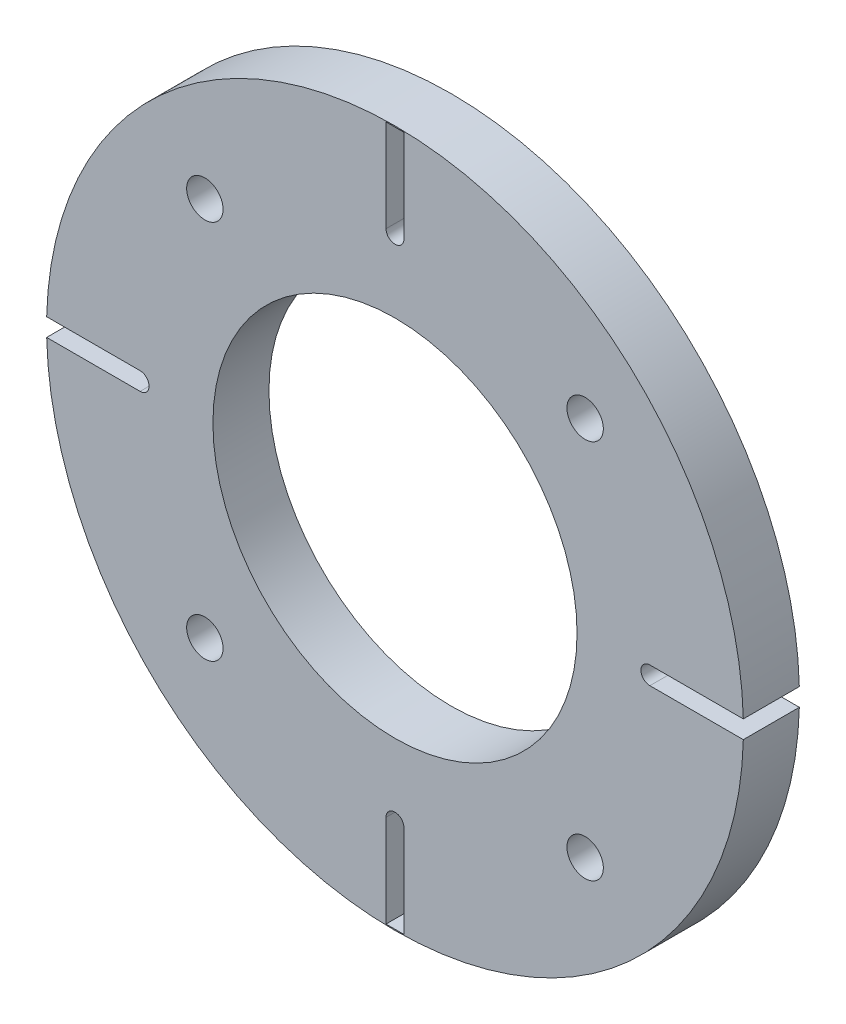
ISO-10303-21;
HEADER;
FILE_DESCRIPTION(('STEP AP214'),'2;1');
FILE_NAME('part.step','',(''),(''),'','','');
FILE_SCHEMA(('AUTOMOTIVE_DESIGN { 1 0 10303 214 1 1 1 1 }'));
ENDSEC;
DATA;
#1=APPLICATION_CONTEXT('core data for automotive mechanical design processes');
#2=APPLICATION_PROTOCOL_DEFINITION('international standard','automotive_design',2000,#1);
#3=PRODUCT_CONTEXT('',#1,'mechanical');
#4=PRODUCT('Part','Part','',(#3));
#5=PRODUCT_RELATED_PRODUCT_CATEGORY('part','',(#4));
#6=PRODUCT_DEFINITION_FORMATION('','',#4);
#7=PRODUCT_DEFINITION_CONTEXT('part definition',#1,'design');
#8=PRODUCT_DEFINITION('design','',#6,#7);
#9=PRODUCT_DEFINITION_SHAPE('','',#8);
#10=(LENGTH_UNIT() NAMED_UNIT(*) SI_UNIT(.MILLI.,.METRE.));
#11=(NAMED_UNIT(*) PLANE_ANGLE_UNIT() SI_UNIT($,.RADIAN.));
#12=(NAMED_UNIT(*) SI_UNIT($,.STERADIAN.) SOLID_ANGLE_UNIT());
#13=UNCERTAINTY_MEASURE_WITH_UNIT(LENGTH_MEASURE(1.E-05),#10,'distance_accuracy_value','');
#14=(GEOMETRIC_REPRESENTATION_CONTEXT(3) GLOBAL_UNCERTAINTY_ASSIGNED_CONTEXT((#13)) GLOBAL_UNIT_ASSIGNED_CONTEXT((#10,
#11,#12)) REPRESENTATION_CONTEXT('',''));
#15=CARTESIAN_POINT('',(0.,0.,0.));
#16=DIRECTION('',(0.,0.,1.));
#17=DIRECTION('',(1.,0.,0.));
#18=AXIS2_PLACEMENT_3D('',#15,#16,#17);
#19=CARTESIAN_POINT('',(0.,0.,10.));
#20=DIRECTION('',(0.,0.,1.));
#21=DIRECTION('',(1.,0.,0.));
#22=AXIS2_PLACEMENT_3D('',#19,#20,#21);
#23=PLANE('',#22);
#24=CARTESIAN_POINT('',(-33.9411254969543,33.9411254969543,10.));
#25=DIRECTION('',(0.,0.,-1.));
#26=DIRECTION('',(-1.,0.,0.));
#27=AXIS2_PLACEMENT_3D('',#24,#25,#26);
#28=CIRCLE('',#27,3.25);
#29=CARTESIAN_POINT('',(-37.1911254969543,33.9411254969543,10.));
#30=VERTEX_POINT('',#29);
#31=EDGE_CURVE('E387',#30,#30,#28,.F.);
#32=ORIENTED_EDGE('',*,*,#31,.F.);
#33=EDGE_LOOP('',(#32));
#34=FACE_BOUND('',#33,.T.);
#35=CARTESIAN_POINT('',(33.9411254969543,33.9411254969543,10.));
#36=DIRECTION('',(0.,0.,-1.));
#37=DIRECTION('',(-1.,0.,0.));
#38=AXIS2_PLACEMENT_3D('',#35,#36,#37);
#39=CIRCLE('',#38,3.25);
#40=CARTESIAN_POINT('',(30.6911254969543,33.9411254969543,10.));
#41=VERTEX_POINT('',#40);
#42=EDGE_CURVE('E295',#41,#41,#39,.T.);
#43=ORIENTED_EDGE('',*,*,#42,.T.);
#44=EDGE_LOOP('',(#43));
#45=FACE_BOUND('',#44,.T.);
#46=DIRECTION('',(-1.,0.,0.));
#47=VECTOR('',#46,1.);
#48=CARTESIAN_POINT('',(62.2,1.6,10.));
#49=LINE('',#48,#47);
#50=CARTESIAN_POINT('',(62.179417816509,1.6,10.));
#51=VERTEX_POINT('',#50);
#52=CARTESIAN_POINT('',(45.5,1.6,10.));
#53=VERTEX_POINT('',#52);
#54=EDGE_CURVE('E186',#51,#53,#49,.T.);
#55=ORIENTED_EDGE('',*,*,#54,.F.);
#56=CARTESIAN_POINT('',(0.,0.,10.));
#57=DIRECTION('',(0.,0.,1.));
#58=DIRECTION('',(1.,0.,0.));
#59=AXIS2_PLACEMENT_3D('',#56,#57,#58);
#60=CIRCLE('',#59,62.2);
#61=CARTESIAN_POINT('',(-62.179417816509,1.59999999999997,10.));
#62=VERTEX_POINT('',#61);
#63=EDGE_CURVE('E338',#51,#62,#60,.T.);
#64=ORIENTED_EDGE('',*,*,#63,.T.);
#65=DIRECTION('',(-1.,0.,0.));
#66=VECTOR('',#65,1.);
#67=CARTESIAN_POINT('',(-62.2,1.59999999999997,10.));
#68=LINE('',#67,#66);
#69=CARTESIAN_POINT('',(-45.5,1.6,10.));
#70=VERTEX_POINT('',#69);
#71=EDGE_CURVE('E299',#70,#62,#68,.T.);
#72=ORIENTED_EDGE('',*,*,#71,.F.);
#73=CARTESIAN_POINT('',(-45.5,0.,10.));
#74=DIRECTION('',(0.,0.,1.));
#75=DIRECTION('',(-1.,0.,0.));
#76=AXIS2_PLACEMENT_3D('',#73,#74,#75);
#77=CIRCLE('',#76,1.6);
#78=CARTESIAN_POINT('',(-45.5,-1.6,10.));
#79=VERTEX_POINT('',#78);
#80=EDGE_CURVE('E257',#79,#70,#77,.T.);
#81=ORIENTED_EDGE('',*,*,#80,.F.);
#82=DIRECTION('',(1.,0.,0.));
#83=VECTOR('',#82,1.);
#84=CARTESIAN_POINT('',(-62.2,-1.60000000000005,10.));
#85=LINE('',#84,#83);
#86=CARTESIAN_POINT('',(-62.179417816509,-1.60000000000005,10.));
#87=VERTEX_POINT('',#86);
#88=EDGE_CURVE('E296',#87,#79,#85,.T.);
#89=ORIENTED_EDGE('',*,*,#88,.F.);
#90=CARTESIAN_POINT('',(62.179417816509,-1.6,10.));
#91=VERTEX_POINT('',#90);
#92=EDGE_CURVE('E334',#87,#91,#60,.T.);
#93=ORIENTED_EDGE('',*,*,#92,.T.);
#94=DIRECTION('',(1.,0.,0.));
#95=VECTOR('',#94,1.);
#96=CARTESIAN_POINT('',(62.2,-1.6,10.));
#97=LINE('',#96,#95);
#98=CARTESIAN_POINT('',(45.5,-1.6,10.));
#99=VERTEX_POINT('',#98);
#100=EDGE_CURVE('E189',#99,#91,#97,.T.);
#101=ORIENTED_EDGE('',*,*,#100,.F.);
#102=CARTESIAN_POINT('',(45.5,0.,10.));
#103=DIRECTION('',(0.,0.,1.));
#104=DIRECTION('',(1.,0.,0.));
#105=AXIS2_PLACEMENT_3D('',#102,#103,#104);
#106=CIRCLE('',#105,1.6);
#107=EDGE_CURVE('E166',#53,#99,#106,.T.);
#108=ORIENTED_EDGE('',*,*,#107,.F.);
#109=EDGE_LOOP('',(#55,#64,#72,#81,#89,#93,#101,#108));
#110=FACE_BOUND('',#109,.T.);
#111=CARTESIAN_POINT('',(0.,45.5,10.));
#112=DIRECTION('',(0.,0.,1.));
#113=DIRECTION('',(1.,0.,0.));
#114=AXIS2_PLACEMENT_3D('',#111,#112,#113);
#115=CIRCLE('',#114,1.6);
#116=CARTESIAN_POINT('',(-1.6,45.5,10.));
#117=VERTEX_POINT('',#116);
#118=CARTESIAN_POINT('',(1.6,45.5,10.));
#119=VERTEX_POINT('',#118);
#120=EDGE_CURVE('E61',#117,#119,#115,.T.);
#121=ORIENTED_EDGE('',*,*,#120,.F.);
#122=DIRECTION('',(0.,-1.,0.));
#123=VECTOR('',#122,1.);
#124=CARTESIAN_POINT('',(-1.6,62.,10.));
#125=LINE('',#124,#123);
#126=CARTESIAN_POINT('',(-1.6,62.,10.));
#127=VERTEX_POINT('',#126);
#128=EDGE_CURVE('E215',#127,#117,#125,.T.);
#129=ORIENTED_EDGE('',*,*,#128,.F.);
#130=DIRECTION('',(-1.,0.,0.));
#131=VECTOR('',#130,1.);
#132=CARTESIAN_POINT('',(-1.6,62.,10.));
#133=LINE('',#132,#131);
#134=CARTESIAN_POINT('',(1.6,62.,10.));
#135=VERTEX_POINT('',#134);
#136=EDGE_CURVE('E219',#135,#127,#133,.T.);
#137=ORIENTED_EDGE('',*,*,#136,.F.);
#138=DIRECTION('',(0.,1.,0.));
#139=VECTOR('',#138,1.);
#140=CARTESIAN_POINT('',(1.6,62.,10.));
#141=LINE('',#140,#139);
#142=EDGE_CURVE('E224',#119,#135,#141,.T.);
#143=ORIENTED_EDGE('',*,*,#142,.F.);
#144=EDGE_LOOP('',(#121,#129,#137,#143));
#145=FACE_BOUND('',#144,.T.);
#146=CARTESIAN_POINT('',(0.,-45.5,10.));
#147=DIRECTION('',(0.,0.,1.));
#148=DIRECTION('',(-1.,0.,0.));
#149=AXIS2_PLACEMENT_3D('',#146,#147,#148);
#150=CIRCLE('',#149,1.6);
#151=CARTESIAN_POINT('',(1.6,-45.5,10.));
#152=VERTEX_POINT('',#151);
#153=CARTESIAN_POINT('',(-1.6,-45.5,10.));
#154=VERTEX_POINT('',#153);
#155=EDGE_CURVE('E69',#152,#154,#150,.T.);
#156=ORIENTED_EDGE('',*,*,#155,.F.);
#157=DIRECTION('',(0.,1.,0.));
#158=VECTOR('',#157,1.);
#159=CARTESIAN_POINT('',(1.6,-62.,10.));
#160=LINE('',#159,#158);
#161=CARTESIAN_POINT('',(1.6,-62.,10.));
#162=VERTEX_POINT('',#161);
#163=EDGE_CURVE('E258',#162,#152,#160,.T.);
#164=ORIENTED_EDGE('',*,*,#163,.F.);
#165=DIRECTION('',(1.,0.,0.));
#166=VECTOR('',#165,1.);
#167=CARTESIAN_POINT('',(-1.6,-62.,10.));
#168=LINE('',#167,#166);
#169=CARTESIAN_POINT('',(-1.6,-62.,10.));
#170=VERTEX_POINT('',#169);
#171=EDGE_CURVE('E262',#170,#162,#168,.T.);
#172=ORIENTED_EDGE('',*,*,#171,.F.);
#173=DIRECTION('',(0.,-1.,0.));
#174=VECTOR('',#173,1.);
#175=CARTESIAN_POINT('',(-1.6,-62.,10.));
#176=LINE('',#175,#174);
#177=EDGE_CURVE('E267',#154,#170,#176,.T.);
#178=ORIENTED_EDGE('',*,*,#177,.F.);
#179=EDGE_LOOP('',(#156,#164,#172,#178));
#180=FACE_BOUND('',#179,.T.);
#181=CARTESIAN_POINT('',(0.,0.,10.));
#182=DIRECTION('',(0.,0.,1.));
#183=DIRECTION('',(1.,0.,0.));
#184=AXIS2_PLACEMENT_3D('',#181,#182,#183);
#185=CIRCLE('',#184,32.5);
#186=CARTESIAN_POINT('',(32.5,0.,10.));
#187=VERTEX_POINT('',#186);
#188=EDGE_CURVE('E325',#187,#187,#185,.T.);
#189=ORIENTED_EDGE('',*,*,#188,.F.);
#190=EDGE_LOOP('',(#189));
#191=FACE_BOUND('',#190,.T.);
#192=CARTESIAN_POINT('',(-33.9411254969543,-33.9411254969543,10.));
#193=DIRECTION('',(0.,0.,-1.));
#194=DIRECTION('',(-1.,0.,0.));
#195=AXIS2_PLACEMENT_3D('',#192,#193,#194);
#196=CIRCLE('',#195,3.25);
#197=CARTESIAN_POINT('',(-37.1911254969543,-33.9411254969543,10.));
#198=VERTEX_POINT('',#197);
#199=EDGE_CURVE('E407',#198,#198,#196,.T.);
#200=ORIENTED_EDGE('',*,*,#199,.T.);
#201=EDGE_LOOP('',(#200));
#202=FACE_BOUND('',#201,.T.);
#203=CARTESIAN_POINT('',(33.9411254969543,-33.9411254969543,10.));
#204=DIRECTION('',(0.,0.,-1.));
#205=DIRECTION('',(-1.,0.,0.));
#206=AXIS2_PLACEMENT_3D('',#203,#204,#205);
#207=CIRCLE('',#206,3.25);
#208=CARTESIAN_POINT('',(30.6911254969543,-33.9411254969543,10.));
#209=VERTEX_POINT('',#208);
#210=EDGE_CURVE('E399',#209,#209,#207,.F.);
#211=ORIENTED_EDGE('',*,*,#210,.F.);
#212=EDGE_LOOP('',(#211));
#213=FACE_BOUND('',#212,.T.);
#214=ADVANCED_FACE('F45',(#34,#45,#110,#145,#180,#191,#202,#213),#23,.T.);
#215=CARTESIAN_POINT('',(0.,0.,0.));
#216=DIRECTION('',(0.,0.,1.));
#217=DIRECTION('',(1.,0.,0.));
#218=AXIS2_PLACEMENT_3D('',#215,#216,#217);
#219=PLANE('',#218);
#220=CARTESIAN_POINT('',(-33.9411254969543,-33.9411254969543,0.));
#221=DIRECTION('',(0.,0.,-1.));
#222=DIRECTION('',(-1.,0.,0.));
#223=AXIS2_PLACEMENT_3D('',#220,#221,#222);
#224=CIRCLE('',#223,3.25);
#225=CARTESIAN_POINT('',(-37.1911254969543,-33.9411254969543,0.));
#226=VERTEX_POINT('',#225);
#227=EDGE_CURVE('E403',#226,#226,#224,.T.);
#228=ORIENTED_EDGE('',*,*,#227,.F.);
#229=EDGE_LOOP('',(#228));
#230=FACE_BOUND('',#229,.T.);
#231=CARTESIAN_POINT('',(33.9411254969543,33.9411254969543,0.));
#232=DIRECTION('',(0.,0.,-1.));
#233=DIRECTION('',(-1.,0.,0.));
#234=AXIS2_PLACEMENT_3D('',#231,#232,#233);
#235=CIRCLE('',#234,3.25);
#236=CARTESIAN_POINT('',(30.6911254969543,33.9411254969543,0.));
#237=VERTEX_POINT('',#236);
#238=EDGE_CURVE('E192',#237,#237,#235,.T.);
#239=ORIENTED_EDGE('',*,*,#238,.F.);
#240=EDGE_LOOP('',(#239));
#241=FACE_BOUND('',#240,.T.);
#242=DIRECTION('',(0.,-1.,0.));
#243=VECTOR('',#242,1.);
#244=CARTESIAN_POINT('',(-1.6,62.,0.));
#245=LINE('',#244,#243);
#246=CARTESIAN_POINT('',(-1.6,62.,0.));
#247=VERTEX_POINT('',#246);
#248=CARTESIAN_POINT('',(-1.6,45.5,0.));
#249=VERTEX_POINT('',#248);
#250=EDGE_CURVE('E205',#247,#249,#245,.T.);
#251=ORIENTED_EDGE('',*,*,#250,.T.);
#252=CARTESIAN_POINT('',(0.,45.5,0.));
#253=DIRECTION('',(0.,0.,1.));
#254=DIRECTION('',(1.,0.,0.));
#255=AXIS2_PLACEMENT_3D('',#252,#253,#254);
#256=CIRCLE('',#255,1.6);
#257=CARTESIAN_POINT('',(1.6,45.5,0.));
#258=VERTEX_POINT('',#257);
#259=EDGE_CURVE('E220',#249,#258,#256,.T.);
#260=ORIENTED_EDGE('',*,*,#259,.T.);
#261=DIRECTION('',(0.,1.,0.));
#262=VECTOR('',#261,1.);
#263=CARTESIAN_POINT('',(1.6,62.,0.));
#264=LINE('',#263,#262);
#265=CARTESIAN_POINT('',(1.6,62.,0.));
#266=VERTEX_POINT('',#265);
#267=EDGE_CURVE('E237',#258,#266,#264,.T.);
#268=ORIENTED_EDGE('',*,*,#267,.T.);
#269=DIRECTION('',(-1.,0.,0.));
#270=VECTOR('',#269,1.);
#271=CARTESIAN_POINT('',(-1.6,62.,0.));
#272=LINE('',#271,#270);
#273=EDGE_CURVE('E233',#266,#247,#272,.T.);
#274=ORIENTED_EDGE('',*,*,#273,.T.);
#275=EDGE_LOOP('',(#251,#260,#268,#274));
#276=FACE_BOUND('',#275,.T.);
#277=DIRECTION('',(0.,1.,0.));
#278=VECTOR('',#277,1.);
#279=CARTESIAN_POINT('',(1.6,-62.,0.));
#280=LINE('',#279,#278);
#281=CARTESIAN_POINT('',(1.6,-62.,0.));
#282=VERTEX_POINT('',#281);
#283=CARTESIAN_POINT('',(1.6,-45.5,0.));
#284=VERTEX_POINT('',#283);
#285=EDGE_CURVE('E247',#282,#284,#280,.T.);
#286=ORIENTED_EDGE('',*,*,#285,.T.);
#287=CARTESIAN_POINT('',(0.,-45.5,0.));
#288=DIRECTION('',(0.,0.,1.));
#289=DIRECTION('',(-1.,0.,0.));
#290=AXIS2_PLACEMENT_3D('',#287,#288,#289);
#291=CIRCLE('',#290,1.6);
#292=CARTESIAN_POINT('',(-1.6,-45.5,0.));
#293=VERTEX_POINT('',#292);
#294=EDGE_CURVE('E263',#284,#293,#291,.T.);
#295=ORIENTED_EDGE('',*,*,#294,.T.);
#296=DIRECTION('',(0.,-1.,0.));
#297=VECTOR('',#296,1.);
#298=CARTESIAN_POINT('',(-1.6,-62.,0.));
#299=LINE('',#298,#297);
#300=CARTESIAN_POINT('',(-1.6,-62.,0.));
#301=VERTEX_POINT('',#300);
#302=EDGE_CURVE('E280',#293,#301,#299,.T.);
#303=ORIENTED_EDGE('',*,*,#302,.T.);
#304=DIRECTION('',(1.,0.,0.));
#305=VECTOR('',#304,1.);
#306=CARTESIAN_POINT('',(-1.6,-62.,0.));
#307=LINE('',#306,#305);
#308=EDGE_CURVE('E276',#301,#282,#307,.T.);
#309=ORIENTED_EDGE('',*,*,#308,.T.);
#310=EDGE_LOOP('',(#286,#295,#303,#309));
#311=FACE_BOUND('',#310,.T.);
#312=CARTESIAN_POINT('',(0.,0.,0.));
#313=DIRECTION('',(0.,0.,1.));
#314=DIRECTION('',(1.,0.,0.));
#315=AXIS2_PLACEMENT_3D('',#312,#313,#314);
#316=CIRCLE('',#315,32.5);
#317=CARTESIAN_POINT('',(32.5,0.,0.));
#318=VERTEX_POINT('',#317);
#319=EDGE_CURVE('E326',#318,#318,#316,.T.);
#320=ORIENTED_EDGE('',*,*,#319,.T.);
#321=EDGE_LOOP('',(#320));
#322=FACE_BOUND('',#321,.T.);
#323=CARTESIAN_POINT('',(0.,0.,0.));
#324=DIRECTION('',(0.,0.,1.));
#325=DIRECTION('',(1.,0.,0.));
#326=AXIS2_PLACEMENT_3D('',#323,#324,#325);
#327=CIRCLE('',#326,62.2);
#328=CARTESIAN_POINT('',(62.179417816509,1.6,0.));
#329=VERTEX_POINT('',#328);
#330=CARTESIAN_POINT('',(-62.179417816509,1.59999999999997,0.));
#331=VERTEX_POINT('',#330);
#332=EDGE_CURVE('E339',#329,#331,#327,.T.);
#333=ORIENTED_EDGE('',*,*,#332,.F.);
#334=DIRECTION('',(-1.,0.,0.));
#335=VECTOR('',#334,1.);
#336=CARTESIAN_POINT('',(0.,1.59999999999999,0.));
#337=LINE('',#336,#335);
#338=CARTESIAN_POINT('',(45.5,1.6,0.));
#339=VERTEX_POINT('',#338);
#340=EDGE_CURVE('E11',#329,#339,#337,.T.);
#341=ORIENTED_EDGE('',*,*,#340,.T.);
#342=CARTESIAN_POINT('',(45.5,0.,0.));
#343=DIRECTION('',(0.,0.,1.));
#344=DIRECTION('',(1.,0.,0.));
#345=AXIS2_PLACEMENT_3D('',#342,#343,#344);
#346=CIRCLE('',#345,1.6);
#347=CARTESIAN_POINT('',(45.5,-1.6,0.));
#348=VERTEX_POINT('',#347);
#349=EDGE_CURVE('E164',#339,#348,#346,.T.);
#350=ORIENTED_EDGE('',*,*,#349,.T.);
#351=DIRECTION('',(1.,0.,0.));
#352=VECTOR('',#351,1.);
#353=CARTESIAN_POINT('',(62.2,-1.6,0.));
#354=LINE('',#353,#352);
#355=CARTESIAN_POINT('',(62.179417816509,-1.6,0.));
#356=VERTEX_POINT('',#355);
#357=EDGE_CURVE('E171',#348,#356,#354,.T.);
#358=ORIENTED_EDGE('',*,*,#357,.T.);
#359=CARTESIAN_POINT('',(-62.179417816509,-1.60000000000005,0.));
#360=VERTEX_POINT('',#359);
#361=EDGE_CURVE('E330',#360,#356,#327,.T.);
#362=ORIENTED_EDGE('',*,*,#361,.F.);
#363=DIRECTION('',(1.,0.,0.));
#364=VECTOR('',#363,1.);
#365=CARTESIAN_POINT('',(0.,-1.59999999999987,0.));
#366=LINE('',#365,#364);
#367=CARTESIAN_POINT('',(-45.5,-1.6,0.));
#368=VERTEX_POINT('',#367);
#369=EDGE_CURVE('E54',#360,#368,#366,.T.);
#370=ORIENTED_EDGE('',*,*,#369,.T.);
#371=CARTESIAN_POINT('',(-45.5,0.,0.));
#372=DIRECTION('',(0.,0.,1.));
#373=DIRECTION('',(-1.,0.,0.));
#374=AXIS2_PLACEMENT_3D('',#371,#372,#373);
#375=CIRCLE('',#374,1.6);
#376=CARTESIAN_POINT('',(-45.5,1.6,0.));
#377=VERTEX_POINT('',#376);
#378=EDGE_CURVE('E300',#368,#377,#375,.T.);
#379=ORIENTED_EDGE('',*,*,#378,.T.);
#380=DIRECTION('',(-1.,0.,0.));
#381=VECTOR('',#380,1.);
#382=CARTESIAN_POINT('',(-62.2,1.59999999999997,0.));
#383=LINE('',#382,#381);
#384=EDGE_CURVE('E290',#377,#331,#383,.T.);
#385=ORIENTED_EDGE('',*,*,#384,.T.);
#386=EDGE_LOOP('',(#333,#341,#350,#358,#362,#370,#379,#385));
#387=FACE_BOUND('',#386,.T.);
#388=CARTESIAN_POINT('',(-33.9411254969543,33.9411254969543,0.));
#389=DIRECTION('',(0.,0.,-1.));
#390=DIRECTION('',(-1.,0.,0.));
#391=AXIS2_PLACEMENT_3D('',#388,#389,#390);
#392=CIRCLE('',#391,3.25);
#393=CARTESIAN_POINT('',(-37.1911254969543,33.9411254969543,0.));
#394=VERTEX_POINT('',#393);
#395=EDGE_CURVE('E411',#394,#394,#392,.F.);
#396=ORIENTED_EDGE('',*,*,#395,.T.);
#397=EDGE_LOOP('',(#396));
#398=FACE_BOUND('',#397,.T.);
#399=CARTESIAN_POINT('',(33.9411254969543,-33.9411254969543,0.));
#400=DIRECTION('',(0.,0.,-1.));
#401=DIRECTION('',(-1.,0.,0.));
#402=AXIS2_PLACEMENT_3D('',#399,#400,#401);
#403=CIRCLE('',#402,3.25);
#404=CARTESIAN_POINT('',(30.6911254969543,-33.9411254969543,0.));
#405=VERTEX_POINT('',#404);
#406=EDGE_CURVE('E395',#405,#405,#403,.F.);
#407=ORIENTED_EDGE('',*,*,#406,.T.);
#408=EDGE_LOOP('',(#407));
#409=FACE_BOUND('',#408,.T.);
#410=ADVANCED_FACE('F183',(#230,#241,#276,#311,#322,#387,#398,#409),#219,.F.);
#411=CARTESIAN_POINT('',(0.,0.,10.));
#412=DIRECTION('',(0.,0.,-1.));
#413=DIRECTION('',(-1.,0.,0.));
#414=AXIS2_PLACEMENT_3D('',#411,#412,#413);
#415=CYLINDRICAL_SURFACE('',#414,62.2);
#416=ORIENTED_EDGE('',*,*,#63,.F.);
#417=DIRECTION('',(0.,0.,-1.));
#418=VECTOR('',#417,1.);
#419=CARTESIAN_POINT('',(62.179417816509,1.6,10.));
#420=LINE('',#419,#418);
#421=EDGE_CURVE('E321',#51,#329,#420,.T.);
#422=ORIENTED_EDGE('',*,*,#421,.T.);
#423=ORIENTED_EDGE('',*,*,#332,.T.);
#424=DIRECTION('',(0.,0.,-1.));
#425=VECTOR('',#424,1.);
#426=CARTESIAN_POINT('',(-62.179417816509,1.59999999999997,10.));
#427=LINE('',#426,#425);
#428=EDGE_CURVE('E200',#331,#62,#427,.F.);
#429=ORIENTED_EDGE('',*,*,#428,.T.);
#430=EDGE_LOOP('',(#416,#422,#423,#429));
#431=FACE_BOUND('',#430,.T.);
#432=ADVANCED_FACE('F352',(#431),#415,.T.);
#433=ORIENTED_EDGE('',*,*,#361,.T.);
#434=DIRECTION('',(0.,0.,-1.));
#435=VECTOR('',#434,1.);
#436=CARTESIAN_POINT('',(62.179417816509,-1.6,10.));
#437=LINE('',#436,#435);
#438=EDGE_CURVE('E176',#356,#91,#437,.F.);
#439=ORIENTED_EDGE('',*,*,#438,.T.);
#440=ORIENTED_EDGE('',*,*,#92,.F.);
#441=DIRECTION('',(0.,0.,-1.));
#442=VECTOR('',#441,1.);
#443=CARTESIAN_POINT('',(-62.179417816509,-1.60000000000005,10.));
#444=LINE('',#443,#442);
#445=EDGE_CURVE('E315',#87,#360,#444,.T.);
#446=ORIENTED_EDGE('',*,*,#445,.T.);
#447=EDGE_LOOP('',(#433,#439,#440,#446));
#448=FACE_BOUND('',#447,.T.);
#449=ADVANCED_FACE('F47',(#448),#415,.T.);
#450=CARTESIAN_POINT('',(0.,0.,0.));
#451=DIRECTION('',(0.,0.,1.));
#452=DIRECTION('',(1.,0.,0.));
#453=AXIS2_PLACEMENT_3D('',#450,#451,#452);
#454=CYLINDRICAL_SURFACE('',#453,32.5);
#455=ORIENTED_EDGE('',*,*,#319,.F.);
#456=EDGE_LOOP('',(#455));
#457=FACE_BOUND('',#456,.T.);
#458=ORIENTED_EDGE('',*,*,#188,.T.);
#459=EDGE_LOOP('',(#458));
#460=FACE_BOUND('',#459,.T.);
#461=ADVANCED_FACE('F366',(#457,#460),#454,.F.);
#462=CARTESIAN_POINT('',(-62.2,-1.60000000000005,0.));
#463=DIRECTION('',(0.,-1.,0.));
#464=DIRECTION('',(1.,0.,0.));
#465=AXIS2_PLACEMENT_3D('',#462,#463,#464);
#466=PLANE('',#465);
#467=ORIENTED_EDGE('',*,*,#88,.T.);
#468=DIRECTION('',(0.,0.,1.));
#469=VECTOR('',#468,1.);
#470=CARTESIAN_POINT('',(-45.5,-1.6,0.));
#471=LINE('',#470,#469);
#472=EDGE_CURVE('E291',#368,#79,#471,.T.);
#473=ORIENTED_EDGE('',*,*,#472,.F.);
#474=ORIENTED_EDGE('',*,*,#369,.F.);
#475=ORIENTED_EDGE('',*,*,#445,.F.);
#476=EDGE_LOOP('',(#467,#473,#474,#475));
#477=FACE_BOUND('',#476,.T.);
#478=ADVANCED_FACE('F364',(#477),#466,.F.);
#479=CARTESIAN_POINT('',(-62.2,1.59999999999997,0.));
#480=DIRECTION('',(0.,1.,0.));
#481=DIRECTION('',(-1.,0.,0.));
#482=AXIS2_PLACEMENT_3D('',#479,#480,#481);
#483=PLANE('',#482);
#484=ORIENTED_EDGE('',*,*,#384,.F.);
#485=DIRECTION('',(0.,0.,1.));
#486=VECTOR('',#485,1.);
#487=CARTESIAN_POINT('',(-45.5,1.6,0.));
#488=LINE('',#487,#486);
#489=EDGE_CURVE('E287',#377,#70,#488,.T.);
#490=ORIENTED_EDGE('',*,*,#489,.T.);
#491=ORIENTED_EDGE('',*,*,#71,.T.);
#492=ORIENTED_EDGE('',*,*,#428,.F.);
#493=EDGE_LOOP('',(#484,#490,#491,#492));
#494=FACE_BOUND('',#493,.T.);
#495=ADVANCED_FACE('F356',(#494),#483,.F.);
#496=CARTESIAN_POINT('',(-45.5,0.,0.));
#497=DIRECTION('',(0.,0.,1.));
#498=DIRECTION('',(1.,0.,0.));
#499=AXIS2_PLACEMENT_3D('',#496,#497,#498);
#500=CYLINDRICAL_SURFACE('',#499,1.6);
#501=ORIENTED_EDGE('',*,*,#80,.T.);
#502=ORIENTED_EDGE('',*,*,#489,.F.);
#503=ORIENTED_EDGE('',*,*,#378,.F.);
#504=ORIENTED_EDGE('',*,*,#472,.T.);
#505=EDGE_LOOP('',(#501,#502,#503,#504));
#506=FACE_BOUND('',#505,.T.);
#507=ADVANCED_FACE('F359',(#506),#500,.F.);
#508=CARTESIAN_POINT('',(0.,-45.5,0.));
#509=DIRECTION('',(0.,0.,1.));
#510=DIRECTION('',(1.,0.,0.));
#511=AXIS2_PLACEMENT_3D('',#508,#509,#510);
#512=CYLINDRICAL_SURFACE('',#511,1.6);
#513=ORIENTED_EDGE('',*,*,#155,.T.);
#514=DIRECTION('',(0.,0.,1.));
#515=VECTOR('',#514,1.);
#516=CARTESIAN_POINT('',(-1.6,-45.5,0.));
#517=LINE('',#516,#515);
#518=EDGE_CURVE('E244',#293,#154,#517,.T.);
#519=ORIENTED_EDGE('',*,*,#518,.F.);
#520=ORIENTED_EDGE('',*,*,#294,.F.);
#521=DIRECTION('',(0.,0.,1.));
#522=VECTOR('',#521,1.);
#523=CARTESIAN_POINT('',(1.6,-45.5,0.));
#524=LINE('',#523,#522);
#525=EDGE_CURVE('E254',#284,#152,#524,.T.);
#526=ORIENTED_EDGE('',*,*,#525,.T.);
#527=EDGE_LOOP('',(#513,#519,#520,#526));
#528=FACE_BOUND('',#527,.T.);
#529=ADVANCED_FACE('F462',(#528),#512,.F.);
#530=CARTESIAN_POINT('',(1.6,-62.,0.));
#531=DIRECTION('',(1.,0.,0.));
#532=DIRECTION('',(0.,1.,0.));
#533=AXIS2_PLACEMENT_3D('',#530,#531,#532);
#534=PLANE('',#533);
#535=ORIENTED_EDGE('',*,*,#163,.T.);
#536=ORIENTED_EDGE('',*,*,#525,.F.);
#537=ORIENTED_EDGE('',*,*,#285,.F.);
#538=DIRECTION('',(0.,0.,1.));
#539=VECTOR('',#538,1.);
#540=CARTESIAN_POINT('',(1.6,-62.,0.));
#541=LINE('',#540,#539);
#542=EDGE_CURVE('E251',#282,#162,#541,.T.);
#543=ORIENTED_EDGE('',*,*,#542,.T.);
#544=EDGE_LOOP('',(#535,#536,#537,#543));
#545=FACE_BOUND('',#544,.T.);
#546=ADVANCED_FACE('F465',(#545),#534,.F.);
#547=CARTESIAN_POINT('',(-1.6,-62.,0.));
#548=DIRECTION('',(0.,-1.,0.));
#549=DIRECTION('',(0.,0.,-1.));
#550=AXIS2_PLACEMENT_3D('',#547,#548,#549);
#551=PLANE('',#550);
#552=ORIENTED_EDGE('',*,*,#171,.T.);
#553=ORIENTED_EDGE('',*,*,#542,.F.);
#554=ORIENTED_EDGE('',*,*,#308,.F.);
#555=DIRECTION('',(0.,0.,1.));
#556=VECTOR('',#555,1.);
#557=CARTESIAN_POINT('',(-1.6,-62.,0.));
#558=LINE('',#557,#556);
#559=EDGE_CURVE('E248',#301,#170,#558,.T.);
#560=ORIENTED_EDGE('',*,*,#559,.T.);
#561=EDGE_LOOP('',(#552,#553,#554,#560));
#562=FACE_BOUND('',#561,.T.);
#563=ADVANCED_FACE('F468',(#562),#551,.F.);
#564=CARTESIAN_POINT('',(-1.6,-62.,0.));
#565=DIRECTION('',(-1.,0.,0.));
#566=DIRECTION('',(0.,-1.,0.));
#567=AXIS2_PLACEMENT_3D('',#564,#565,#566);
#568=PLANE('',#567);
#569=ORIENTED_EDGE('',*,*,#177,.T.);
#570=ORIENTED_EDGE('',*,*,#559,.F.);
#571=ORIENTED_EDGE('',*,*,#302,.F.);
#572=ORIENTED_EDGE('',*,*,#518,.T.);
#573=EDGE_LOOP('',(#569,#570,#571,#572));
#574=FACE_BOUND('',#573,.T.);
#575=ADVANCED_FACE('F451',(#574),#568,.F.);
#576=CARTESIAN_POINT('',(0.,45.5,0.));
#577=DIRECTION('',(0.,0.,1.));
#578=DIRECTION('',(1.,0.,0.));
#579=AXIS2_PLACEMENT_3D('',#576,#577,#578);
#580=CYLINDRICAL_SURFACE('',#579,1.6);
#581=ORIENTED_EDGE('',*,*,#120,.T.);
#582=DIRECTION('',(0.,0.,1.));
#583=VECTOR('',#582,1.);
#584=CARTESIAN_POINT('',(1.6,45.5,0.));
#585=LINE('',#584,#583);
#586=EDGE_CURVE('E202',#258,#119,#585,.T.);
#587=ORIENTED_EDGE('',*,*,#586,.F.);
#588=ORIENTED_EDGE('',*,*,#259,.F.);
#589=DIRECTION('',(0.,0.,1.));
#590=VECTOR('',#589,1.);
#591=CARTESIAN_POINT('',(-1.6,45.5,0.));
#592=LINE('',#591,#590);
#593=EDGE_CURVE('E212',#249,#117,#592,.T.);
#594=ORIENTED_EDGE('',*,*,#593,.T.);
#595=EDGE_LOOP('',(#581,#587,#588,#594));
#596=FACE_BOUND('',#595,.T.);
#597=ADVANCED_FACE('F447',(#596),#580,.F.);
#598=CARTESIAN_POINT('',(-1.6,62.,0.));
#599=DIRECTION('',(-1.,0.,0.));
#600=DIRECTION('',(0.,-1.,0.));
#601=AXIS2_PLACEMENT_3D('',#598,#599,#600);
#602=PLANE('',#601);
#603=ORIENTED_EDGE('',*,*,#128,.T.);
#604=ORIENTED_EDGE('',*,*,#593,.F.);
#605=ORIENTED_EDGE('',*,*,#250,.F.);
#606=DIRECTION('',(0.,0.,1.));
#607=VECTOR('',#606,1.);
#608=CARTESIAN_POINT('',(-1.6,62.,0.));
#609=LINE('',#608,#607);
#610=EDGE_CURVE('E209',#247,#127,#609,.T.);
#611=ORIENTED_EDGE('',*,*,#610,.T.);
#612=EDGE_LOOP('',(#603,#604,#605,#611));
#613=FACE_BOUND('',#612,.T.);
#614=ADVANCED_FACE('F450',(#613),#602,.F.);
#615=CARTESIAN_POINT('',(-1.6,62.,0.));
#616=DIRECTION('',(0.,1.,0.));
#617=DIRECTION('',(0.,0.,1.));
#618=AXIS2_PLACEMENT_3D('',#615,#616,#617);
#619=PLANE('',#618);
#620=ORIENTED_EDGE('',*,*,#136,.T.);
#621=ORIENTED_EDGE('',*,*,#610,.F.);
#622=ORIENTED_EDGE('',*,*,#273,.F.);
#623=DIRECTION('',(0.,0.,1.));
#624=VECTOR('',#623,1.);
#625=CARTESIAN_POINT('',(1.6,62.,0.));
#626=LINE('',#625,#624);
#627=EDGE_CURVE('E206',#266,#135,#626,.T.);
#628=ORIENTED_EDGE('',*,*,#627,.T.);
#629=EDGE_LOOP('',(#620,#621,#622,#628));
#630=FACE_BOUND('',#629,.T.);
#631=ADVANCED_FACE('F454',(#630),#619,.F.);
#632=CARTESIAN_POINT('',(1.6,62.,0.));
#633=DIRECTION('',(1.,0.,0.));
#634=DIRECTION('',(0.,1.,0.));
#635=AXIS2_PLACEMENT_3D('',#632,#633,#634);
#636=PLANE('',#635);
#637=ORIENTED_EDGE('',*,*,#142,.T.);
#638=ORIENTED_EDGE('',*,*,#627,.F.);
#639=ORIENTED_EDGE('',*,*,#267,.F.);
#640=ORIENTED_EDGE('',*,*,#586,.T.);
#641=EDGE_LOOP('',(#637,#638,#639,#640));
#642=FACE_BOUND('',#641,.T.);
#643=ADVANCED_FACE('F442',(#642),#636,.F.);
#644=CARTESIAN_POINT('',(62.2,1.6,0.));
#645=DIRECTION('',(0.,1.,0.));
#646=DIRECTION('',(-1.,0.,0.));
#647=AXIS2_PLACEMENT_3D('',#644,#645,#646);
#648=PLANE('',#647);
#649=ORIENTED_EDGE('',*,*,#54,.T.);
#650=DIRECTION('',(0.,0.,1.));
#651=VECTOR('',#650,1.);
#652=CARTESIAN_POINT('',(45.5,1.6,0.));
#653=LINE('',#652,#651);
#654=EDGE_CURVE('E170',#339,#53,#653,.T.);
#655=ORIENTED_EDGE('',*,*,#654,.F.);
#656=ORIENTED_EDGE('',*,*,#340,.F.);
#657=ORIENTED_EDGE('',*,*,#421,.F.);
#658=EDGE_LOOP('',(#649,#655,#656,#657));
#659=FACE_BOUND('',#658,.T.);
#660=ADVANCED_FACE('F439',(#659),#648,.F.);
#661=CARTESIAN_POINT('',(62.2,-1.6,0.));
#662=DIRECTION('',(0.,-1.,0.));
#663=DIRECTION('',(1.,0.,0.));
#664=AXIS2_PLACEMENT_3D('',#661,#662,#663);
#665=PLANE('',#664);
#666=ORIENTED_EDGE('',*,*,#357,.F.);
#667=DIRECTION('',(0.,0.,1.));
#668=VECTOR('',#667,1.);
#669=CARTESIAN_POINT('',(45.5,-1.6,0.));
#670=LINE('',#669,#668);
#671=EDGE_CURVE('E159',#348,#99,#670,.T.);
#672=ORIENTED_EDGE('',*,*,#671,.T.);
#673=ORIENTED_EDGE('',*,*,#100,.T.);
#674=ORIENTED_EDGE('',*,*,#438,.F.);
#675=EDGE_LOOP('',(#666,#672,#673,#674));
#676=FACE_BOUND('',#675,.T.);
#677=ADVANCED_FACE('F174',(#676),#665,.F.);
#678=CARTESIAN_POINT('',(45.5,0.,0.));
#679=DIRECTION('',(0.,0.,1.));
#680=DIRECTION('',(1.,0.,0.));
#681=AXIS2_PLACEMENT_3D('',#678,#679,#680);
#682=CYLINDRICAL_SURFACE('',#681,1.6);
#683=ORIENTED_EDGE('',*,*,#107,.T.);
#684=ORIENTED_EDGE('',*,*,#671,.F.);
#685=ORIENTED_EDGE('',*,*,#349,.F.);
#686=ORIENTED_EDGE('',*,*,#654,.T.);
#687=EDGE_LOOP('',(#683,#684,#685,#686));
#688=FACE_BOUND('',#687,.T.);
#689=ADVANCED_FACE('F161',(#688),#682,.F.);
#690=CARTESIAN_POINT('',(33.9411254969543,33.9411254969543,10.));
#691=DIRECTION('',(0.,0.,-1.));
#692=DIRECTION('',(-1.,0.,0.));
#693=AXIS2_PLACEMENT_3D('',#690,#691,#692);
#694=CYLINDRICAL_SURFACE('',#693,3.25);
#695=ORIENTED_EDGE('',*,*,#42,.F.);
#696=EDGE_LOOP('',(#695));
#697=FACE_BOUND('',#696,.T.);
#698=ORIENTED_EDGE('',*,*,#238,.T.);
#699=EDGE_LOOP('',(#698));
#700=FACE_BOUND('',#699,.T.);
#701=ADVANCED_FACE('F421',(#697,#700),#694,.F.);
#702=CARTESIAN_POINT('',(-33.9411254969543,33.9411254969543,10.));
#703=DIRECTION('',(0.,0.,-1.));
#704=DIRECTION('',(-1.,0.,0.));
#705=AXIS2_PLACEMENT_3D('',#702,#703,#704);
#706=CYLINDRICAL_SURFACE('',#705,3.25);
#707=ORIENTED_EDGE('',*,*,#31,.T.);
#708=EDGE_LOOP('',(#707));
#709=FACE_BOUND('',#708,.T.);
#710=ORIENTED_EDGE('',*,*,#395,.F.);
#711=EDGE_LOOP('',(#710));
#712=FACE_BOUND('',#711,.T.);
#713=ADVANCED_FACE('F417',(#709,#712),#706,.F.);
#714=CARTESIAN_POINT('',(-33.9411254969543,-33.9411254969543,10.));
#715=DIRECTION('',(0.,0.,-1.));
#716=DIRECTION('',(-1.,0.,0.));
#717=AXIS2_PLACEMENT_3D('',#714,#715,#716);
#718=CYLINDRICAL_SURFACE('',#717,3.25);
#719=ORIENTED_EDGE('',*,*,#199,.F.);
#720=EDGE_LOOP('',(#719));
#721=FACE_BOUND('',#720,.T.);
#722=ORIENTED_EDGE('',*,*,#227,.T.);
#723=EDGE_LOOP('',(#722));
#724=FACE_BOUND('',#723,.T.);
#725=ADVANCED_FACE('F420',(#721,#724),#718,.F.);
#726=CARTESIAN_POINT('',(33.9411254969543,-33.9411254969543,10.));
#727=DIRECTION('',(0.,0.,-1.));
#728=DIRECTION('',(-1.,0.,0.));
#729=AXIS2_PLACEMENT_3D('',#726,#727,#728);
#730=CYLINDRICAL_SURFACE('',#729,3.25);
#731=ORIENTED_EDGE('',*,*,#210,.T.);
#732=EDGE_LOOP('',(#731));
#733=FACE_BOUND('',#732,.T.);
#734=ORIENTED_EDGE('',*,*,#406,.F.);
#735=EDGE_LOOP('',(#734));
#736=FACE_BOUND('',#735,.T.);
#737=ADVANCED_FACE('F427',(#733,#736),#730,.F.);
#738=CLOSED_SHELL('',(#214,#410,#432,#449,#461,#478,#495,#507,#529,#546,#563,#575,#597,#614,
#631,#643,#660,#677,#689,#701,#713,#725,#737));
#739=MANIFOLD_SOLID_BREP('B2',#738);
#740=ADVANCED_BREP_SHAPE_REPRESENTATION('',(#18,#739),#14);
#741=SHAPE_DEFINITION_REPRESENTATION(#9,#740);
ENDSEC;
END-ISO-10303-21;
